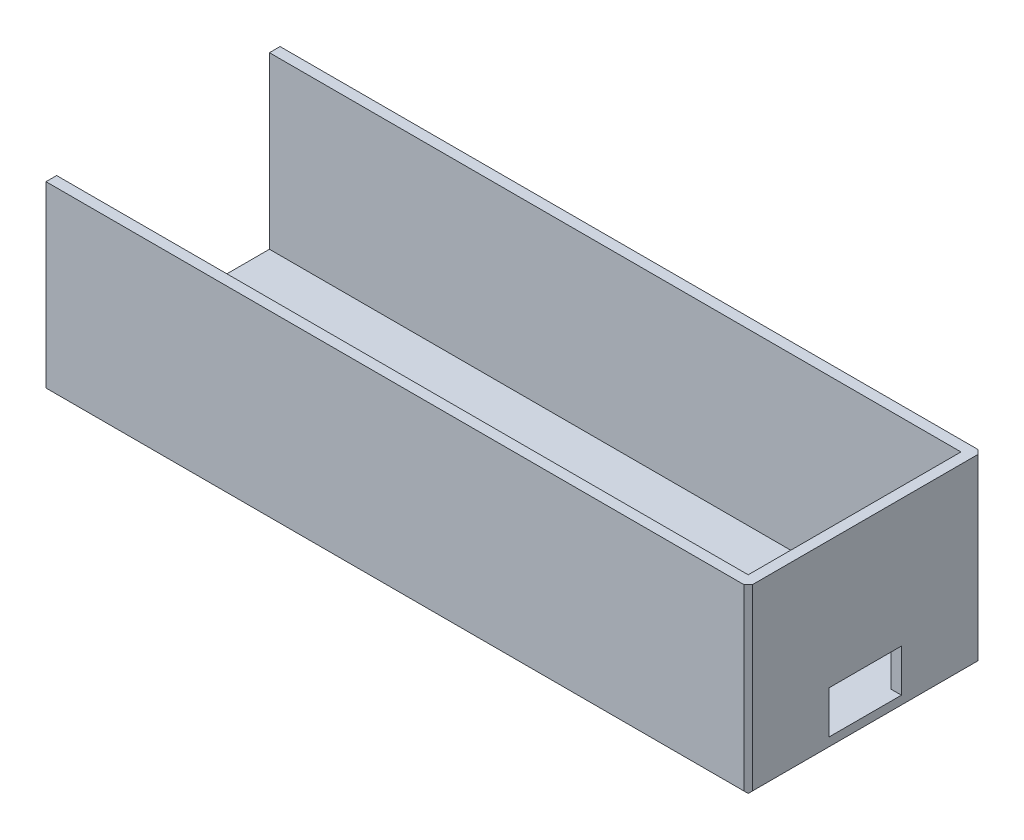
ISO-10303-21;
HEADER;
FILE_DESCRIPTION(('STEP AP214'),'2;1');
FILE_NAME('part.step','',(''),(''),'','','');
FILE_SCHEMA(('AUTOMOTIVE_DESIGN { 1 0 10303 214 1 1 1 1 }'));
ENDSEC;
DATA;
#1=APPLICATION_CONTEXT('core data for automotive mechanical design processes');
#2=APPLICATION_PROTOCOL_DEFINITION('international standard','automotive_design',2000,#1);
#3=PRODUCT_CONTEXT('',#1,'mechanical');
#4=PRODUCT('Part','Part','',(#3));
#5=PRODUCT_RELATED_PRODUCT_CATEGORY('part','',(#4));
#6=PRODUCT_DEFINITION_FORMATION('','',#4);
#7=PRODUCT_DEFINITION_CONTEXT('part definition',#1,'design');
#8=PRODUCT_DEFINITION('design','',#6,#7);
#9=PRODUCT_DEFINITION_SHAPE('','',#8);
#10=(LENGTH_UNIT() NAMED_UNIT(*) SI_UNIT(.MILLI.,.METRE.));
#11=(NAMED_UNIT(*) PLANE_ANGLE_UNIT() SI_UNIT($,.RADIAN.));
#12=(NAMED_UNIT(*) SI_UNIT($,.STERADIAN.) SOLID_ANGLE_UNIT());
#13=UNCERTAINTY_MEASURE_WITH_UNIT(LENGTH_MEASURE(1.E-05),#10,'distance_accuracy_value','');
#14=(GEOMETRIC_REPRESENTATION_CONTEXT(3) GLOBAL_UNCERTAINTY_ASSIGNED_CONTEXT((#13)) GLOBAL_UNIT_ASSIGNED_CONTEXT((#10,
#11,#12)) REPRESENTATION_CONTEXT('',''));
#15=CARTESIAN_POINT('',(0.,0.,0.));
#16=DIRECTION('',(0.,0.,1.));
#17=DIRECTION('',(1.,0.,0.));
#18=AXIS2_PLACEMENT_3D('',#15,#16,#17);
#19=CARTESIAN_POINT('',(160.,-173.925271309261,0.));
#20=DIRECTION('',(1.,0.,0.));
#21=DIRECTION('',(0.,0.,-1.));
#22=AXIS2_PLACEMENT_3D('',#19,#20,#21);
#23=PLANE('',#22);
#24=DIRECTION('',(0.,1.,0.));
#25=VECTOR('',#24,1.);
#26=CARTESIAN_POINT('',(160.,-173.925271309261,33.5));
#27=LINE('',#26,#25);
#28=CARTESIAN_POINT('',(160.,3.,33.5));
#29=VERTEX_POINT('',#28);
#30=CARTESIAN_POINT('',(160.,13.,33.5));
#31=VERTEX_POINT('',#30);
#32=EDGE_CURVE('E287',#29,#31,#27,.T.);
#33=ORIENTED_EDGE('',*,*,#32,.F.);
#34=DIRECTION('',(0.,0.,1.));
#35=VECTOR('',#34,1.);
#36=CARTESIAN_POINT('',(160.,3.,0.));
#37=LINE('',#36,#35);
#38=CARTESIAN_POINT('',(160.,3.,50.));
#39=VERTEX_POINT('',#38);
#40=EDGE_CURVE('E467',#29,#39,#37,.T.);
#41=ORIENTED_EDGE('',*,*,#40,.T.);
#42=DIRECTION('',(0.,1.,0.));
#43=VECTOR('',#42,1.);
#44=CARTESIAN_POINT('',(160.,-173.925271309261,50.));
#45=LINE('',#44,#43);
#46=CARTESIAN_POINT('',(160.,43.,50.));
#47=VERTEX_POINT('',#46);
#48=EDGE_CURVE('E331',#39,#47,#45,.T.);
#49=ORIENTED_EDGE('',*,*,#48,.T.);
#50=DIRECTION('',(0.,0.,-1.));
#51=VECTOR('',#50,1.);
#52=CARTESIAN_POINT('',(160.,43.,0.));
#53=LINE('',#52,#51);
#54=CARTESIAN_POINT('',(160.,43.,0.));
#55=VERTEX_POINT('',#54);
#56=EDGE_CURVE('E308',#47,#55,#53,.T.);
#57=ORIENTED_EDGE('',*,*,#56,.T.);
#58=DIRECTION('',(0.,1.,0.));
#59=VECTOR('',#58,1.);
#60=CARTESIAN_POINT('',(160.,-173.925271309261,0.));
#61=LINE('',#60,#59);
#62=CARTESIAN_POINT('',(160.,3.,0.));
#63=VERTEX_POINT('',#62);
#64=EDGE_CURVE('E332',#63,#55,#61,.T.);
#65=ORIENTED_EDGE('',*,*,#64,.F.);
#66=CARTESIAN_POINT('',(160.,3.,16.5));
#67=VERTEX_POINT('',#66);
#68=EDGE_CURVE('E468',#63,#67,#37,.T.);
#69=ORIENTED_EDGE('',*,*,#68,.T.);
#70=DIRECTION('',(0.,1.,0.));
#71=VECTOR('',#70,1.);
#72=CARTESIAN_POINT('',(160.,-173.925271309261,16.5000000000001));
#73=LINE('',#72,#71);
#74=CARTESIAN_POINT('',(160.,13.,16.5));
#75=VERTEX_POINT('',#74);
#76=EDGE_CURVE('E280',#67,#75,#73,.T.);
#77=ORIENTED_EDGE('',*,*,#76,.T.);
#78=DIRECTION('',(0.,0.,-1.));
#79=VECTOR('',#78,1.);
#80=CARTESIAN_POINT('',(160.,13.,0.));
#81=LINE('',#80,#79);
#82=EDGE_CURVE('E12',#31,#75,#81,.T.);
#83=ORIENTED_EDGE('',*,*,#82,.F.);
#84=EDGE_LOOP('',(#33,#41,#49,#57,#65,#69,#77,#83));
#85=FACE_BOUND('',#84,.T.);
#86=ADVANCED_FACE('F99',(#85),#23,.F.);
#87=CARTESIAN_POINT('',(0.,0.,0.));
#88=DIRECTION('',(0.,1.,0.));
#89=DIRECTION('',(0.,0.,1.));
#90=AXIS2_PLACEMENT_3D('',#87,#88,#89);
#91=PLANE('',#90);
#92=DIRECTION('',(0.,0.,1.));
#93=VECTOR('',#92,1.);
#94=CARTESIAN_POINT('',(79.,0.,0.));
#95=LINE('',#94,#93);
#96=CARTESIAN_POINT('',(79.,0.,-10.));
#97=VERTEX_POINT('',#96);
#98=CARTESIAN_POINT('',(79.,0.,-1.5));
#99=VERTEX_POINT('',#98);
#100=EDGE_CURVE('E451',#97,#99,#95,.T.);
#101=ORIENTED_EDGE('',*,*,#100,.T.);
#102=DIRECTION('',(1.,0.,0.));
#103=VECTOR('',#102,1.);
#104=CARTESIAN_POINT('',(162.5,0.,-1.5));
#105=LINE('',#104,#103);
#106=CARTESIAN_POINT('',(161.5,0.,-1.5));
#107=VERTEX_POINT('',#106);
#108=EDGE_CURVE('E342',#99,#107,#105,.T.);
#109=ORIENTED_EDGE('',*,*,#108,.T.);
#110=DIRECTION('',(0.,0.,1.));
#111=VECTOR('',#110,1.);
#112=CARTESIAN_POINT('',(161.5,0.,52.5));
#113=LINE('',#112,#111);
#114=CARTESIAN_POINT('',(161.5,0.,51.5));
#115=VERTEX_POINT('',#114);
#116=EDGE_CURVE('E355',#107,#115,#113,.T.);
#117=ORIENTED_EDGE('',*,*,#116,.T.);
#118=DIRECTION('',(-1.,0.,0.));
#119=VECTOR('',#118,1.);
#120=CARTESIAN_POINT('',(-2.49999999999999,0.,51.5));
#121=LINE('',#120,#119);
#122=CARTESIAN_POINT('',(-1.49999999999999,0.,51.5));
#123=VERTEX_POINT('',#122);
#124=EDGE_CURVE('E352',#115,#123,#121,.T.);
#125=ORIENTED_EDGE('',*,*,#124,.T.);
#126=DIRECTION('',(0.,0.,-1.));
#127=VECTOR('',#126,1.);
#128=CARTESIAN_POINT('',(-1.5,0.,-2.5));
#129=LINE('',#128,#127);
#130=CARTESIAN_POINT('',(-1.5,0.,-1.5));
#131=VERTEX_POINT('',#130);
#132=EDGE_CURVE('E349',#123,#131,#129,.T.);
#133=ORIENTED_EDGE('',*,*,#132,.T.);
#134=CARTESIAN_POINT('',(61.,0.,-1.5));
#135=VERTEX_POINT('',#134);
#136=EDGE_CURVE('E345',#131,#135,#105,.T.);
#137=ORIENTED_EDGE('',*,*,#136,.T.);
#138=DIRECTION('',(0.,0.,1.));
#139=VECTOR('',#138,1.);
#140=CARTESIAN_POINT('',(61.,0.,0.));
#141=LINE('',#140,#139);
#142=CARTESIAN_POINT('',(61.,0.,-10.));
#143=VERTEX_POINT('',#142);
#144=EDGE_CURVE('E436',#143,#135,#141,.T.);
#145=ORIENTED_EDGE('',*,*,#144,.F.);
#146=CARTESIAN_POINT('',(70.,0.,-10.));
#147=DIRECTION('',(0.,1.,0.));
#148=DIRECTION('',(0.,0.,1.));
#149=AXIS2_PLACEMENT_3D('',#146,#147,#148);
#150=CIRCLE('',#149,9.00000000000001);
#151=EDGE_CURVE('E455',#97,#143,#150,.T.);
#152=ORIENTED_EDGE('',*,*,#151,.F.);
#153=EDGE_LOOP('',(#101,#109,#117,#125,#133,#137,#145,#152));
#154=FACE_BOUND('',#153,.T.);
#155=CARTESIAN_POINT('',(70.,0.,-10.));
#156=DIRECTION('',(0.,1.,0.));
#157=DIRECTION('',(0.,0.,1.));
#158=AXIS2_PLACEMENT_3D('',#155,#156,#157);
#159=CIRCLE('',#158,4.00000000000001);
#160=CARTESIAN_POINT('',(70.,0.,-5.99999999999999));
#161=VERTEX_POINT('',#160);
#162=EDGE_CURVE('E430',#161,#161,#159,.T.);
#163=ORIENTED_EDGE('',*,*,#162,.T.);
#164=EDGE_LOOP('',(#163));
#165=FACE_BOUND('',#164,.T.);
#166=ADVANCED_FACE('F101',(#154,#165),#91,.F.);
#167=CARTESIAN_POINT('',(79.,5.,0.));
#168=DIRECTION('',(1.,0.,0.));
#169=DIRECTION('',(0.,0.,-1.));
#170=AXIS2_PLACEMENT_3D('',#167,#168,#169);
#171=PLANE('',#170);
#172=DIRECTION('',(0.,1.,0.));
#173=VECTOR('',#172,1.);
#174=CARTESIAN_POINT('',(79.,5.,-2.5));
#175=LINE('',#174,#173);
#176=CARTESIAN_POINT('',(79.,1.,-2.5));
#177=VERTEX_POINT('',#176);
#178=CARTESIAN_POINT('',(79.,5.,-2.5));
#179=VERTEX_POINT('',#178);
#180=EDGE_CURVE('E422',#177,#179,#175,.T.);
#181=ORIENTED_EDGE('',*,*,#180,.F.);
#182=DIRECTION('',(0.,0.707106781186548,-0.707106781186548));
#183=VECTOR('',#182,1.);
#184=CARTESIAN_POINT('',(79.,1.75,-3.25));
#185=LINE('',#184,#183);
#186=EDGE_CURVE('E426',#99,#177,#185,.T.);
#187=ORIENTED_EDGE('',*,*,#186,.F.);
#188=ORIENTED_EDGE('',*,*,#100,.F.);
#189=DIRECTION('',(0.,-1.,0.));
#190=VECTOR('',#189,1.);
#191=CARTESIAN_POINT('',(79.,5.,-10.));
#192=LINE('',#191,#190);
#193=CARTESIAN_POINT('',(79.,5.,-10.));
#194=VERTEX_POINT('',#193);
#195=EDGE_CURVE('E464',#194,#97,#192,.T.);
#196=ORIENTED_EDGE('',*,*,#195,.F.);
#197=DIRECTION('',(0.,0.,1.));
#198=VECTOR('',#197,1.);
#199=CARTESIAN_POINT('',(79.,5.,0.));
#200=LINE('',#199,#198);
#201=EDGE_CURVE('E435',#194,#179,#200,.T.);
#202=ORIENTED_EDGE('',*,*,#201,.T.);
#203=EDGE_LOOP('',(#181,#187,#188,#196,#202));
#204=FACE_BOUND('',#203,.T.);
#205=ADVANCED_FACE('F532',(#204),#171,.T.);
#206=CARTESIAN_POINT('',(70.,5.,-10.));
#207=DIRECTION('',(0.,-1.,0.));
#208=DIRECTION('',(0.,0.,-1.));
#209=AXIS2_PLACEMENT_3D('',#206,#207,#208);
#210=CYLINDRICAL_SURFACE('',#209,9.00000000000001);
#211=ORIENTED_EDGE('',*,*,#151,.T.);
#212=DIRECTION('',(0.,-1.,0.));
#213=VECTOR('',#212,1.);
#214=CARTESIAN_POINT('',(61.,5.,-10.));
#215=LINE('',#214,#213);
#216=CARTESIAN_POINT('',(61.,5.,-10.));
#217=VERTEX_POINT('',#216);
#218=EDGE_CURVE('E447',#217,#143,#215,.T.);
#219=ORIENTED_EDGE('',*,*,#218,.F.);
#220=CARTESIAN_POINT('',(70.,5.,-10.));
#221=DIRECTION('',(0.,1.,0.));
#222=DIRECTION('',(0.,0.,1.));
#223=AXIS2_PLACEMENT_3D('',#220,#221,#222);
#224=CIRCLE('',#223,9.00000000000001);
#225=EDGE_CURVE('E440',#194,#217,#224,.T.);
#226=ORIENTED_EDGE('',*,*,#225,.F.);
#227=ORIENTED_EDGE('',*,*,#195,.T.);
#228=EDGE_LOOP('',(#211,#219,#226,#227));
#229=FACE_BOUND('',#228,.T.);
#230=ADVANCED_FACE('F529',(#229),#210,.T.);
#231=CARTESIAN_POINT('',(61.,5.,0.));
#232=DIRECTION('',(1.,0.,0.));
#233=DIRECTION('',(0.,0.,-1.));
#234=AXIS2_PLACEMENT_3D('',#231,#232,#233);
#235=PLANE('',#234);
#236=DIRECTION('',(0.,0.707106781186548,-0.707106781186548));
#237=VECTOR('',#236,1.);
#238=CARTESIAN_POINT('',(61.,1.75,-3.25));
#239=LINE('',#238,#237);
#240=CARTESIAN_POINT('',(61.,1.,-2.5));
#241=VERTEX_POINT('',#240);
#242=EDGE_CURVE('E108',#135,#241,#239,.T.);
#243=ORIENTED_EDGE('',*,*,#242,.T.);
#244=DIRECTION('',(0.,1.,0.));
#245=VECTOR('',#244,1.);
#246=CARTESIAN_POINT('',(61.,5.,-2.5));
#247=LINE('',#246,#245);
#248=CARTESIAN_POINT('',(61.,5.,-2.5));
#249=VERTEX_POINT('',#248);
#250=EDGE_CURVE('E418',#241,#249,#247,.T.);
#251=ORIENTED_EDGE('',*,*,#250,.T.);
#252=DIRECTION('',(0.,0.,1.));
#253=VECTOR('',#252,1.);
#254=CARTESIAN_POINT('',(61.,5.,0.));
#255=LINE('',#254,#253);
#256=EDGE_CURVE('E444',#217,#249,#255,.T.);
#257=ORIENTED_EDGE('',*,*,#256,.F.);
#258=ORIENTED_EDGE('',*,*,#218,.T.);
#259=ORIENTED_EDGE('',*,*,#144,.T.);
#260=EDGE_LOOP('',(#243,#251,#257,#258,#259));
#261=FACE_BOUND('',#260,.T.);
#262=ADVANCED_FACE('F486',(#261),#235,.F.);
#263=CARTESIAN_POINT('',(70.,5.,-10.));
#264=DIRECTION('',(0.,-1.,0.));
#265=DIRECTION('',(0.,0.,-1.));
#266=AXIS2_PLACEMENT_3D('',#263,#264,#265);
#267=CYLINDRICAL_SURFACE('',#266,4.00000000000001);
#268=CARTESIAN_POINT('',(70.,5.,-10.));
#269=DIRECTION('',(0.,1.,0.));
#270=DIRECTION('',(0.,0.,1.));
#271=AXIS2_PLACEMENT_3D('',#268,#269,#270);
#272=CIRCLE('',#271,4.00000000000001);
#273=CARTESIAN_POINT('',(70.,5.,-5.99999999999999));
#274=VERTEX_POINT('',#273);
#275=EDGE_CURVE('E431',#274,#274,#272,.T.);
#276=ORIENTED_EDGE('',*,*,#275,.T.);
#277=EDGE_LOOP('',(#276));
#278=FACE_BOUND('',#277,.T.);
#279=ORIENTED_EDGE('',*,*,#162,.F.);
#280=EDGE_LOOP('',(#279));
#281=FACE_BOUND('',#280,.T.);
#282=ADVANCED_FACE('F629',(#278,#281),#267,.F.);
#283=CARTESIAN_POINT('',(0.,5.,0.));
#284=DIRECTION('',(0.,1.,0.));
#285=DIRECTION('',(0.,0.,1.));
#286=AXIS2_PLACEMENT_3D('',#283,#284,#285);
#287=PLANE('',#286);
#288=DIRECTION('',(-1.,0.,0.));
#289=VECTOR('',#288,1.);
#290=CARTESIAN_POINT('',(0.,5.,-2.5));
#291=LINE('',#290,#289);
#292=EDGE_CURVE('E479',#179,#249,#291,.T.);
#293=ORIENTED_EDGE('',*,*,#292,.F.);
#294=ORIENTED_EDGE('',*,*,#201,.F.);
#295=ORIENTED_EDGE('',*,*,#225,.T.);
#296=ORIENTED_EDGE('',*,*,#256,.T.);
#297=EDGE_LOOP('',(#293,#294,#295,#296));
#298=FACE_BOUND('',#297,.T.);
#299=ORIENTED_EDGE('',*,*,#275,.F.);
#300=EDGE_LOOP('',(#299));
#301=FACE_BOUND('',#300,.T.);
#302=ADVANCED_FACE('F626',(#298,#301),#287,.T.);
#303=CARTESIAN_POINT('',(0.,0.,-1.5));
#304=DIRECTION('',(0.,-0.707106781186547,-0.707106781186547));
#305=DIRECTION('',(-1.,0.,0.));
#306=AXIS2_PLACEMENT_3D('',#303,#304,#305);
#307=PLANE('',#306);
#308=ORIENTED_EDGE('',*,*,#242,.F.);
#309=ORIENTED_EDGE('',*,*,#136,.F.);
#310=DIRECTION('',(-0.577350269189626,0.577350269189626,-0.577350269189626));
#311=VECTOR('',#310,1.);
#312=CARTESIAN_POINT('',(-1.,-0.5,-0.999999999999999));
#313=LINE('',#312,#311);
#314=CARTESIAN_POINT('',(-2.5,1.,-2.5));
#315=VERTEX_POINT('',#314);
#316=EDGE_CURVE('E296',#131,#315,#313,.T.);
#317=ORIENTED_EDGE('',*,*,#316,.T.);
#318=DIRECTION('',(-1.,0.,0.));
#319=VECTOR('',#318,1.);
#320=CARTESIAN_POINT('',(-2.5,1.,-2.5));
#321=LINE('',#320,#319);
#322=EDGE_CURVE('E370',#241,#315,#321,.T.);
#323=ORIENTED_EDGE('',*,*,#322,.F.);
#324=EDGE_LOOP('',(#308,#309,#317,#323));
#325=FACE_BOUND('',#324,.T.);
#326=ADVANCED_FACE('F493',(#325),#307,.T.);
#327=CARTESIAN_POINT('',(0.,-173.925271309261,52.5));
#328=DIRECTION('',(0.,0.,1.));
#329=DIRECTION('',(1.,0.,0.));
#330=AXIS2_PLACEMENT_3D('',#327,#328,#329);
#331=PLANE('',#330);
#332=DIRECTION('',(1.,0.,0.));
#333=VECTOR('',#332,1.);
#334=CARTESIAN_POINT('',(162.5,1.,52.5));
#335=LINE('',#334,#333);
#336=CARTESIAN_POINT('',(-2.49999999999999,1.,52.5));
#337=VERTEX_POINT('',#336);
#338=CARTESIAN_POINT('',(161.5,1.,52.5));
#339=VERTEX_POINT('',#338);
#340=EDGE_CURVE('E363',#337,#339,#335,.T.);
#341=ORIENTED_EDGE('',*,*,#340,.T.);
#342=DIRECTION('',(0.,1.,0.));
#343=VECTOR('',#342,1.);
#344=CARTESIAN_POINT('',(161.5,-173.925271309261,52.5));
#345=LINE('',#344,#343);
#346=CARTESIAN_POINT('',(161.5,43.,52.5));
#347=VERTEX_POINT('',#346);
#348=EDGE_CURVE('E411',#339,#347,#345,.T.);
#349=ORIENTED_EDGE('',*,*,#348,.T.);
#350=DIRECTION('',(1.,0.,0.));
#351=VECTOR('',#350,1.);
#352=CARTESIAN_POINT('',(0.,43.,52.5));
#353=LINE('',#352,#351);
#354=CARTESIAN_POINT('',(-2.49999999999999,43.,52.5));
#355=VERTEX_POINT('',#354);
#356=EDGE_CURVE('E320',#355,#347,#353,.T.);
#357=ORIENTED_EDGE('',*,*,#356,.F.);
#358=DIRECTION('',(0.,1.,0.));
#359=VECTOR('',#358,1.);
#360=CARTESIAN_POINT('',(-2.49999999999999,-173.925271309261,52.5));
#361=LINE('',#360,#359);
#362=EDGE_CURVE('E335',#337,#355,#361,.T.);
#363=ORIENTED_EDGE('',*,*,#362,.F.);
#364=EDGE_LOOP('',(#341,#349,#357,#363));
#365=FACE_BOUND('',#364,.T.);
#366=ADVANCED_FACE('F545',(#365),#331,.T.);
#367=CARTESIAN_POINT('',(162.5,-173.925271309261,0.));
#368=DIRECTION('',(1.,0.,0.));
#369=DIRECTION('',(0.,0.,-1.));
#370=AXIS2_PLACEMENT_3D('',#367,#368,#369);
#371=PLANE('',#370);
#372=DIRECTION('',(0.,0.,-1.));
#373=VECTOR('',#372,1.);
#374=CARTESIAN_POINT('',(162.5,3.00000000000001,0.));
#375=LINE('',#374,#373);
#376=CARTESIAN_POINT('',(162.5,3.,33.5));
#377=VERTEX_POINT('',#376);
#378=CARTESIAN_POINT('',(162.5,3.,16.5));
#379=VERTEX_POINT('',#378);
#380=EDGE_CURVE('E115',#377,#379,#375,.T.);
#381=ORIENTED_EDGE('',*,*,#380,.F.);
#382=DIRECTION('',(0.,1.,0.));
#383=VECTOR('',#382,1.);
#384=CARTESIAN_POINT('',(162.5,0.,33.5));
#385=LINE('',#384,#383);
#386=CARTESIAN_POINT('',(162.5,13.,33.5));
#387=VERTEX_POINT('',#386);
#388=EDGE_CURVE('E268',#377,#387,#385,.T.);
#389=ORIENTED_EDGE('',*,*,#388,.T.);
#390=DIRECTION('',(0.,0.,-1.));
#391=VECTOR('',#390,1.);
#392=CARTESIAN_POINT('',(162.5,13.,0.));
#393=LINE('',#392,#391);
#394=CARTESIAN_POINT('',(162.5,13.,16.5));
#395=VERTEX_POINT('',#394);
#396=EDGE_CURVE('E251',#387,#395,#393,.T.);
#397=ORIENTED_EDGE('',*,*,#396,.T.);
#398=DIRECTION('',(0.,1.,0.));
#399=VECTOR('',#398,1.);
#400=CARTESIAN_POINT('',(162.5,0.,16.5));
#401=LINE('',#400,#399);
#402=EDGE_CURVE('E260',#379,#395,#401,.T.);
#403=ORIENTED_EDGE('',*,*,#402,.F.);
#404=EDGE_LOOP('',(#381,#389,#397,#403));
#405=FACE_BOUND('',#404,.T.);
#406=DIRECTION('',(0.,0.,-1.));
#407=VECTOR('',#406,1.);
#408=CARTESIAN_POINT('',(162.5,1.,-2.5));
#409=LINE('',#408,#407);
#410=CARTESIAN_POINT('',(162.5,1.,51.5));
#411=VERTEX_POINT('',#410);
#412=CARTESIAN_POINT('',(162.5,1.,-1.5));
#413=VERTEX_POINT('',#412);
#414=EDGE_CURVE('E359',#411,#413,#409,.T.);
#415=ORIENTED_EDGE('',*,*,#414,.T.);
#416=DIRECTION('',(0.,1.,0.));
#417=VECTOR('',#416,1.);
#418=CARTESIAN_POINT('',(162.5,-173.925271309261,-1.5));
#419=LINE('',#418,#417);
#420=CARTESIAN_POINT('',(162.5,43.,-1.5));
#421=VERTEX_POINT('',#420);
#422=EDGE_CURVE('E391',#413,#421,#419,.T.);
#423=ORIENTED_EDGE('',*,*,#422,.T.);
#424=DIRECTION('',(0.,0.,-1.));
#425=VECTOR('',#424,1.);
#426=CARTESIAN_POINT('',(162.5,43.,0.));
#427=LINE('',#426,#425);
#428=CARTESIAN_POINT('',(162.5,43.,51.5));
#429=VERTEX_POINT('',#428);
#430=EDGE_CURVE('E324',#429,#421,#427,.T.);
#431=ORIENTED_EDGE('',*,*,#430,.F.);
#432=DIRECTION('',(0.,-1.,0.));
#433=VECTOR('',#432,1.);
#434=CARTESIAN_POINT('',(162.5,-173.925271309261,51.5));
#435=LINE('',#434,#433);
#436=EDGE_CURVE('E375',#429,#411,#435,.T.);
#437=ORIENTED_EDGE('',*,*,#436,.T.);
#438=EDGE_LOOP('',(#415,#423,#431,#437));
#439=FACE_BOUND('',#438,.T.);
#440=ADVANCED_FACE('F265',(#405,#439),#371,.T.);
#441=CARTESIAN_POINT('',(0.,-173.925271309261,-2.5));
#442=DIRECTION('',(0.,0.,-1.));
#443=DIRECTION('',(-1.,0.,0.));
#444=AXIS2_PLACEMENT_3D('',#441,#442,#443);
#445=PLANE('',#444);
#446=CARTESIAN_POINT('',(161.5,1.,-2.5));
#447=VERTEX_POINT('',#446);
#448=EDGE_CURVE('E371',#447,#177,#321,.T.);
#449=ORIENTED_EDGE('',*,*,#448,.T.);
#450=ORIENTED_EDGE('',*,*,#180,.T.);
#451=ORIENTED_EDGE('',*,*,#292,.T.);
#452=ORIENTED_EDGE('',*,*,#250,.F.);
#453=ORIENTED_EDGE('',*,*,#322,.T.);
#454=DIRECTION('',(0.,1.,0.));
#455=VECTOR('',#454,1.);
#456=CARTESIAN_POINT('',(-2.5,-173.925271309261,-2.5));
#457=LINE('',#456,#455);
#458=CARTESIAN_POINT('',(-2.5,43.,-2.5));
#459=VERTEX_POINT('',#458);
#460=EDGE_CURVE('E338',#315,#459,#457,.T.);
#461=ORIENTED_EDGE('',*,*,#460,.T.);
#462=DIRECTION('',(-1.,0.,0.));
#463=VECTOR('',#462,1.);
#464=CARTESIAN_POINT('',(0.,43.,-2.5));
#465=LINE('',#464,#463);
#466=CARTESIAN_POINT('',(161.5,43.,-2.5));
#467=VERTEX_POINT('',#466);
#468=EDGE_CURVE('E328',#467,#459,#465,.T.);
#469=ORIENTED_EDGE('',*,*,#468,.F.);
#470=DIRECTION('',(0.,-1.,0.));
#471=VECTOR('',#470,1.);
#472=CARTESIAN_POINT('',(161.5,-173.925271309261,-2.5));
#473=LINE('',#472,#471);
#474=EDGE_CURVE('E400',#467,#447,#473,.T.);
#475=ORIENTED_EDGE('',*,*,#474,.T.);
#476=EDGE_LOOP('',(#449,#450,#451,#452,#453,#461,#469,#475));
#477=FACE_BOUND('',#476,.T.);
#478=ADVANCED_FACE('F491',(#477),#445,.T.);
#479=CARTESIAN_POINT('',(-2.5,-173.925271309261,0.));
#480=DIRECTION('',(-1.,0.,0.));
#481=DIRECTION('',(0.,0.,1.));
#482=AXIS2_PLACEMENT_3D('',#479,#480,#481);
#483=PLANE('',#482);
#484=ORIENTED_EDGE('',*,*,#460,.F.);
#485=DIRECTION('',(0.,0.,1.));
#486=VECTOR('',#485,1.);
#487=CARTESIAN_POINT('',(-2.49999999999999,1.,52.5));
#488=LINE('',#487,#486);
#489=EDGE_CURVE('E367',#315,#337,#488,.T.);
#490=ORIENTED_EDGE('',*,*,#489,.T.);
#491=ORIENTED_EDGE('',*,*,#362,.T.);
#492=DIRECTION('',(0.,0.,1.));
#493=VECTOR('',#492,1.);
#494=CARTESIAN_POINT('',(-2.5,43.,0.));
#495=LINE('',#494,#493);
#496=CARTESIAN_POINT('',(-2.49999999999999,43.,50.));
#497=VERTEX_POINT('',#496);
#498=EDGE_CURVE('E315',#497,#355,#495,.T.);
#499=ORIENTED_EDGE('',*,*,#498,.F.);
#500=DIRECTION('',(0.,1.,0.));
#501=VECTOR('',#500,1.);
#502=CARTESIAN_POINT('',(-2.5,43.,50.));
#503=LINE('',#502,#501);
#504=CARTESIAN_POINT('',(-2.5,3.,50.));
#505=VERTEX_POINT('',#504);
#506=EDGE_CURVE('E300',#505,#497,#503,.T.);
#507=ORIENTED_EDGE('',*,*,#506,.F.);
#508=DIRECTION('',(0.,0.,1.));
#509=VECTOR('',#508,1.);
#510=CARTESIAN_POINT('',(-2.5,3.,0.));
#511=LINE('',#510,#509);
#512=CARTESIAN_POINT('',(-2.5,3.,0.));
#513=VERTEX_POINT('',#512);
#514=EDGE_CURVE('E295',#513,#505,#511,.T.);
#515=ORIENTED_EDGE('',*,*,#514,.F.);
#516=DIRECTION('',(0.,-1.,0.));
#517=VECTOR('',#516,1.);
#518=CARTESIAN_POINT('',(-2.5,43.,0.));
#519=LINE('',#518,#517);
#520=CARTESIAN_POINT('',(-2.5,43.,0.));
#521=VERTEX_POINT('',#520);
#522=EDGE_CURVE('E291',#521,#513,#519,.T.);
#523=ORIENTED_EDGE('',*,*,#522,.F.);
#524=EDGE_CURVE('E316',#459,#521,#495,.T.);
#525=ORIENTED_EDGE('',*,*,#524,.F.);
#526=EDGE_LOOP('',(#484,#490,#491,#499,#507,#515,#523,#525));
#527=FACE_BOUND('',#526,.T.);
#528=ADVANCED_FACE('F550',(#527),#483,.T.);
#529=CARTESIAN_POINT('',(0.,-173.925271309261,50.));
#530=DIRECTION('',(0.,0.,1.));
#531=DIRECTION('',(1.,0.,0.));
#532=AXIS2_PLACEMENT_3D('',#529,#530,#531);
#533=PLANE('',#532);
#534=DIRECTION('',(1.,0.,0.));
#535=VECTOR('',#534,1.);
#536=CARTESIAN_POINT('',(0.,3.,50.));
#537=LINE('',#536,#535);
#538=EDGE_CURVE('E475',#505,#39,#537,.T.);
#539=ORIENTED_EDGE('',*,*,#538,.F.);
#540=ORIENTED_EDGE('',*,*,#506,.T.);
#541=DIRECTION('',(1.,0.,0.));
#542=VECTOR('',#541,1.);
#543=CARTESIAN_POINT('',(0.,43.,50.));
#544=LINE('',#543,#542);
#545=EDGE_CURVE('E304',#497,#47,#544,.T.);
#546=ORIENTED_EDGE('',*,*,#545,.T.);
#547=ORIENTED_EDGE('',*,*,#48,.F.);
#548=EDGE_LOOP('',(#539,#540,#546,#547));
#549=FACE_BOUND('',#548,.T.);
#550=ADVANCED_FACE('F559',(#549),#533,.F.);
#551=CARTESIAN_POINT('',(0.,43.,0.));
#552=DIRECTION('',(0.,1.,0.));
#553=DIRECTION('',(0.,0.,1.));
#554=AXIS2_PLACEMENT_3D('',#551,#552,#553);
#555=PLANE('',#554);
#556=ORIENTED_EDGE('',*,*,#430,.T.);
#557=DIRECTION('',(0.707106781186548,0.,0.707106781186548));
#558=VECTOR('',#557,1.);
#559=CARTESIAN_POINT('',(82.,43.,-82.));
#560=LINE('',#559,#558);
#561=EDGE_CURVE('E397',#421,#467,#560,.F.);
#562=ORIENTED_EDGE('',*,*,#561,.T.);
#563=ORIENTED_EDGE('',*,*,#468,.T.);
#564=ORIENTED_EDGE('',*,*,#524,.T.);
#565=DIRECTION('',(-1.,0.,0.));
#566=VECTOR('',#565,1.);
#567=CARTESIAN_POINT('',(0.,43.,0.));
#568=LINE('',#567,#566);
#569=EDGE_CURVE('E312',#55,#521,#568,.T.);
#570=ORIENTED_EDGE('',*,*,#569,.F.);
#571=ORIENTED_EDGE('',*,*,#56,.F.);
#572=ORIENTED_EDGE('',*,*,#545,.F.);
#573=ORIENTED_EDGE('',*,*,#498,.T.);
#574=ORIENTED_EDGE('',*,*,#356,.T.);
#575=DIRECTION('',(-0.707106781186548,0.,0.707106781186548));
#576=VECTOR('',#575,1.);
#577=CARTESIAN_POINT('',(107.,43.,107.));
#578=LINE('',#577,#576);
#579=EDGE_CURVE('E394',#347,#429,#578,.F.);
#580=ORIENTED_EDGE('',*,*,#579,.T.);
#581=EDGE_LOOP('',(#556,#562,#563,#564,#570,#571,#572,#573,#574,#580));
#582=FACE_BOUND('',#581,.T.);
#583=ADVANCED_FACE('F553',(#582),#555,.T.);
#584=CARTESIAN_POINT('',(-1.5,0.,0.));
#585=DIRECTION('',(-0.707106781186547,-0.707106781186547,0.));
#586=DIRECTION('',(0.,0.,1.));
#587=AXIS2_PLACEMENT_3D('',#584,#585,#586);
#588=PLANE('',#587);
#589=DIRECTION('',(-0.577350269189626,0.577350269189626,0.577350269189626));
#590=VECTOR('',#589,1.);
#591=CARTESIAN_POINT('',(15.6666666666667,-17.1666666666667,34.3333333333333));
#592=LINE('',#591,#590);
#593=EDGE_CURVE('E382',#337,#123,#592,.F.);
#594=ORIENTED_EDGE('',*,*,#593,.F.);
#595=ORIENTED_EDGE('',*,*,#489,.F.);
#596=ORIENTED_EDGE('',*,*,#316,.F.);
#597=ORIENTED_EDGE('',*,*,#132,.F.);
#598=EDGE_LOOP('',(#594,#595,#596,#597));
#599=FACE_BOUND('',#598,.T.);
#600=ADVANCED_FACE('F524',(#599),#588,.T.);
#601=ORIENTED_EDGE('',*,*,#108,.F.);
#602=ORIENTED_EDGE('',*,*,#186,.T.);
#603=ORIENTED_EDGE('',*,*,#448,.F.);
#604=DIRECTION('',(-0.577350269189626,0.577350269189626,-0.577350269189626));
#605=VECTOR('',#604,1.);
#606=CARTESIAN_POINT('',(108.333333333333,54.1666666666667,-55.6666666666667));
#607=LINE('',#606,#605);
#608=CARTESIAN_POINT('',(162.,0.500000000000007,-2.00000000000001));
#609=VERTEX_POINT('',#608);
#610=EDGE_CURVE('E403',#447,#609,#607,.F.);
#611=ORIENTED_EDGE('',*,*,#610,.T.);
#612=DIRECTION('',(-0.577350269189626,-0.577350269189626,0.577350269189626));
#613=VECTOR('',#612,1.);
#614=CARTESIAN_POINT('',(107.666666666667,-53.8333333333333,52.3333333333333));
#615=LINE('',#614,#613);
#616=EDGE_CURVE('E378',#107,#609,#615,.F.);
#617=ORIENTED_EDGE('',*,*,#616,.F.);
#618=EDGE_LOOP('',(#601,#602,#603,#611,#617));
#619=FACE_BOUND('',#618,.T.);
#620=ADVANCED_FACE('F507',(#619),#307,.T.);
#621=CARTESIAN_POINT('',(0.,0.,51.5));
#622=DIRECTION('',(0.,-0.707106781186547,0.707106781186547));
#623=DIRECTION('',(1.,0.,0.));
#624=AXIS2_PLACEMENT_3D('',#621,#622,#623);
#625=PLANE('',#624);
#626=DIRECTION('',(0.577350269189626,0.577350269189626,0.577350269189626));
#627=VECTOR('',#626,1.);
#628=CARTESIAN_POINT('',(107.666666666667,-53.8333333333334,-2.33333333333337));
#629=LINE('',#628,#627);
#630=CARTESIAN_POINT('',(162.,0.499999999999973,52.));
#631=VERTEX_POINT('',#630);
#632=EDGE_CURVE('E290',#631,#115,#629,.F.);
#633=ORIENTED_EDGE('',*,*,#632,.F.);
#634=DIRECTION('',(0.577350269189626,-0.577350269189626,-0.577350269189626));
#635=VECTOR('',#634,1.);
#636=CARTESIAN_POINT('',(108.333333333333,54.1666666666667,105.666666666667));
#637=LINE('',#636,#635);
#638=EDGE_CURVE('E415',#631,#339,#637,.F.);
#639=ORIENTED_EDGE('',*,*,#638,.T.);
#640=ORIENTED_EDGE('',*,*,#340,.F.);
#641=ORIENTED_EDGE('',*,*,#593,.T.);
#642=ORIENTED_EDGE('',*,*,#124,.F.);
#643=EDGE_LOOP('',(#633,#639,#640,#641,#642));
#644=FACE_BOUND('',#643,.T.);
#645=ADVANCED_FACE('F519',(#644),#625,.T.);
#646=CARTESIAN_POINT('',(161.5,0.,0.));
#647=DIRECTION('',(0.707106781186547,-0.707106781186547,0.));
#648=DIRECTION('',(0.,0.,-1.));
#649=AXIS2_PLACEMENT_3D('',#646,#647,#648);
#650=PLANE('',#649);
#651=ORIENTED_EDGE('',*,*,#616,.T.);
#652=DIRECTION('',(-0.577350269189626,-0.577350269189626,-0.577350269189626));
#653=VECTOR('',#652,1.);
#654=CARTESIAN_POINT('',(162.333333333333,0.833333333333304,-1.6666666666667));
#655=LINE('',#654,#653);
#656=EDGE_CURVE('E408',#609,#413,#655,.F.);
#657=ORIENTED_EDGE('',*,*,#656,.T.);
#658=ORIENTED_EDGE('',*,*,#414,.F.);
#659=DIRECTION('',(0.577350269189626,0.577350269189626,-0.577350269189626));
#660=VECTOR('',#659,1.);
#661=CARTESIAN_POINT('',(179.,17.5,35.));
#662=LINE('',#661,#660);
#663=EDGE_CURVE('E405',#411,#631,#662,.F.);
#664=ORIENTED_EDGE('',*,*,#663,.T.);
#665=ORIENTED_EDGE('',*,*,#632,.T.);
#666=ORIENTED_EDGE('',*,*,#116,.F.);
#667=EDGE_LOOP('',(#651,#657,#658,#664,#665,#666));
#668=FACE_BOUND('',#667,.T.);
#669=ADVANCED_FACE('F512',(#668),#650,.T.);
#670=CARTESIAN_POINT('',(162.5,-173.925271309261,-1.5));
#671=DIRECTION('',(-0.707106781186547,0.,0.707106781186547));
#672=DIRECTION('',(0.,1.,0.));
#673=AXIS2_PLACEMENT_3D('',#670,#671,#672);
#674=PLANE('',#673);
#675=ORIENTED_EDGE('',*,*,#610,.F.);
#676=ORIENTED_EDGE('',*,*,#474,.F.);
#677=ORIENTED_EDGE('',*,*,#561,.F.);
#678=ORIENTED_EDGE('',*,*,#422,.F.);
#679=ORIENTED_EDGE('',*,*,#656,.F.);
#680=EDGE_LOOP('',(#675,#676,#677,#678,#679));
#681=FACE_BOUND('',#680,.T.);
#682=ADVANCED_FACE('F536',(#681),#674,.F.);
#683=CARTESIAN_POINT('',(161.5,-173.925271309261,52.5));
#684=DIRECTION('',(-0.707106781186547,0.,-0.707106781186547));
#685=DIRECTION('',(0.,1.,0.));
#686=AXIS2_PLACEMENT_3D('',#683,#684,#685);
#687=PLANE('',#686);
#688=ORIENTED_EDGE('',*,*,#663,.F.);
#689=ORIENTED_EDGE('',*,*,#436,.F.);
#690=ORIENTED_EDGE('',*,*,#579,.F.);
#691=ORIENTED_EDGE('',*,*,#348,.F.);
#692=ORIENTED_EDGE('',*,*,#638,.F.);
#693=EDGE_LOOP('',(#688,#689,#690,#691,#692));
#694=FACE_BOUND('',#693,.T.);
#695=ADVANCED_FACE('F541',(#694),#687,.F.);
#696=CARTESIAN_POINT('',(0.,5.,0.));
#697=DIRECTION('',(0.,0.,-1.));
#698=DIRECTION('',(-1.,0.,0.));
#699=AXIS2_PLACEMENT_3D('',#696,#697,#698);
#700=PLANE('',#699);
#701=DIRECTION('',(1.,0.,0.));
#702=VECTOR('',#701,1.);
#703=CARTESIAN_POINT('',(0.,3.,0.));
#704=LINE('',#703,#702);
#705=EDGE_CURVE('E472',#513,#63,#704,.T.);
#706=ORIENTED_EDGE('',*,*,#705,.T.);
#707=ORIENTED_EDGE('',*,*,#64,.T.);
#708=ORIENTED_EDGE('',*,*,#569,.T.);
#709=ORIENTED_EDGE('',*,*,#522,.T.);
#710=EDGE_LOOP('',(#706,#707,#708,#709));
#711=FACE_BOUND('',#710,.T.);
#712=ADVANCED_FACE('F568',(#711),#700,.F.);
#713=CARTESIAN_POINT('',(0.,3.,0.));
#714=DIRECTION('',(0.,1.,0.));
#715=DIRECTION('',(0.,0.,1.));
#716=AXIS2_PLACEMENT_3D('',#713,#714,#715);
#717=PLANE('',#716);
#718=ORIENTED_EDGE('',*,*,#40,.F.);
#719=DIRECTION('',(1.,0.,0.));
#720=VECTOR('',#719,1.);
#721=CARTESIAN_POINT('',(152.5,3.,33.5));
#722=LINE('',#721,#720);
#723=EDGE_CURVE('E277',#29,#377,#722,.T.);
#724=ORIENTED_EDGE('',*,*,#723,.T.);
#725=ORIENTED_EDGE('',*,*,#380,.T.);
#726=DIRECTION('',(1.,0.,0.));
#727=VECTOR('',#726,1.);
#728=CARTESIAN_POINT('',(152.5,3.,16.5));
#729=LINE('',#728,#727);
#730=EDGE_CURVE('E257',#67,#379,#729,.T.);
#731=ORIENTED_EDGE('',*,*,#730,.F.);
#732=ORIENTED_EDGE('',*,*,#68,.F.);
#733=ORIENTED_EDGE('',*,*,#705,.F.);
#734=ORIENTED_EDGE('',*,*,#514,.T.);
#735=ORIENTED_EDGE('',*,*,#538,.T.);
#736=EDGE_LOOP('',(#718,#724,#725,#731,#732,#733,#734,#735));
#737=FACE_BOUND('',#736,.T.);
#738=ADVANCED_FACE('F564',(#737),#717,.T.);
#739=CARTESIAN_POINT('',(152.5,13.,0.));
#740=DIRECTION('',(0.,-1.,0.));
#741=DIRECTION('',(0.,0.,-1.));
#742=AXIS2_PLACEMENT_3D('',#739,#740,#741);
#743=PLANE('',#742);
#744=ORIENTED_EDGE('',*,*,#82,.T.);
#745=DIRECTION('',(1.,0.,0.));
#746=VECTOR('',#745,1.);
#747=CARTESIAN_POINT('',(152.5,13.,16.5));
#748=LINE('',#747,#746);
#749=EDGE_CURVE('E123',#75,#395,#748,.T.);
#750=ORIENTED_EDGE('',*,*,#749,.T.);
#751=ORIENTED_EDGE('',*,*,#396,.F.);
#752=DIRECTION('',(1.,0.,0.));
#753=VECTOR('',#752,1.);
#754=CARTESIAN_POINT('',(152.5,13.,33.5));
#755=LINE('',#754,#753);
#756=EDGE_CURVE('E256',#31,#387,#755,.T.);
#757=ORIENTED_EDGE('',*,*,#756,.F.);
#758=EDGE_LOOP('',(#744,#750,#751,#757));
#759=FACE_BOUND('',#758,.T.);
#760=ADVANCED_FACE('F248',(#759),#743,.T.);
#761=CARTESIAN_POINT('',(152.5,0.,33.5));
#762=DIRECTION('',(0.,0.,-1.));
#763=DIRECTION('',(-1.,0.,0.));
#764=AXIS2_PLACEMENT_3D('',#761,#762,#763);
#765=PLANE('',#764);
#766=ORIENTED_EDGE('',*,*,#32,.T.);
#767=ORIENTED_EDGE('',*,*,#756,.T.);
#768=ORIENTED_EDGE('',*,*,#388,.F.);
#769=ORIENTED_EDGE('',*,*,#723,.F.);
#770=EDGE_LOOP('',(#766,#767,#768,#769));
#771=FACE_BOUND('',#770,.T.);
#772=ADVANCED_FACE('F572',(#771),#765,.T.);
#773=CARTESIAN_POINT('',(152.5,0.,16.5));
#774=DIRECTION('',(0.,0.,-1.));
#775=DIRECTION('',(0.,1.,0.));
#776=AXIS2_PLACEMENT_3D('',#773,#774,#775);
#777=PLANE('',#776);
#778=ORIENTED_EDGE('',*,*,#730,.T.);
#779=ORIENTED_EDGE('',*,*,#402,.T.);
#780=ORIENTED_EDGE('',*,*,#749,.F.);
#781=ORIENTED_EDGE('',*,*,#76,.F.);
#782=EDGE_LOOP('',(#778,#779,#780,#781));
#783=FACE_BOUND('',#782,.T.);
#784=ADVANCED_FACE('F261',(#783),#777,.F.);
#785=CLOSED_SHELL('',(#86,#166,#205,#230,#262,#282,#302,#326,#366,#440,#478,#528,#550,#583,#600,
#620,#645,#669,#682,#695,#712,#738,#760,#772,#784));
#786=MANIFOLD_SOLID_BREP('B2',#785);
#787=ADVANCED_BREP_SHAPE_REPRESENTATION('',(#18,#786),#14);
#788=SHAPE_DEFINITION_REPRESENTATION(#9,#787);
ENDSEC;
END-ISO-10303-21;
